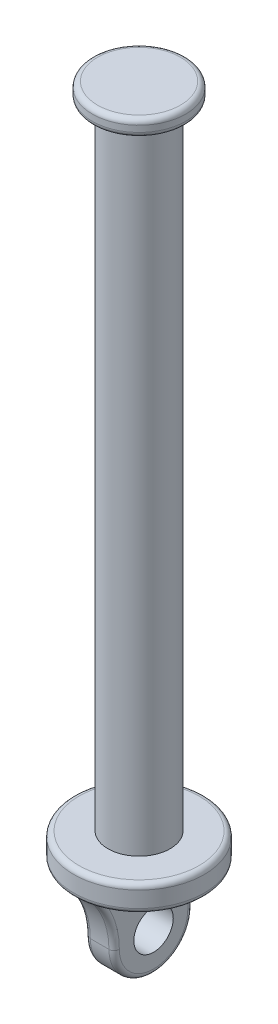
ISO-10303-21;
HEADER;
FILE_DESCRIPTION(('STEP AP214'),'2;1');
FILE_NAME('part.step','',(''),(''),'','','');
FILE_SCHEMA(('AUTOMOTIVE_DESIGN { 1 0 10303 214 1 1 1 1 }'));
ENDSEC;
DATA;
#1=APPLICATION_CONTEXT('core data for automotive mechanical design processes');
#2=APPLICATION_PROTOCOL_DEFINITION('international standard','automotive_design',2000,#1);
#3=PRODUCT_CONTEXT('',#1,'mechanical');
#4=PRODUCT('Part','Part','',(#3));
#5=PRODUCT_RELATED_PRODUCT_CATEGORY('part','',(#4));
#6=PRODUCT_DEFINITION_FORMATION('','',#4);
#7=PRODUCT_DEFINITION_CONTEXT('part definition',#1,'design');
#8=PRODUCT_DEFINITION('design','',#6,#7);
#9=PRODUCT_DEFINITION_SHAPE('','',#8);
#10=(LENGTH_UNIT() NAMED_UNIT(*) SI_UNIT(.MILLI.,.METRE.));
#11=(NAMED_UNIT(*) PLANE_ANGLE_UNIT() SI_UNIT($,.RADIAN.));
#12=(NAMED_UNIT(*) SI_UNIT($,.STERADIAN.) SOLID_ANGLE_UNIT());
#13=UNCERTAINTY_MEASURE_WITH_UNIT(LENGTH_MEASURE(1.E-05),#10,'distance_accuracy_value','');
#14=(GEOMETRIC_REPRESENTATION_CONTEXT(3) GLOBAL_UNCERTAINTY_ASSIGNED_CONTEXT((#13)) GLOBAL_UNIT_ASSIGNED_CONTEXT((#10,
#11,#12)) REPRESENTATION_CONTEXT('',''));
#15=CARTESIAN_POINT('',(0.,0.,0.));
#16=DIRECTION('',(0.,0.,1.));
#17=DIRECTION('',(1.,0.,0.));
#18=AXIS2_PLACEMENT_3D('',#15,#16,#17);
#19=CARTESIAN_POINT('',(0.,-12.7,0.));
#20=DIRECTION('',(0.,-1.,0.));
#21=DIRECTION('',(0.,0.,-1.));
#22=AXIS2_PLACEMENT_3D('',#19,#20,#21);
#23=PLANE('',#22);
#24=CARTESIAN_POINT('',(0.,-12.7,0.));
#25=DIRECTION('',(0.,-1.,0.));
#26=DIRECTION('',(0.,0.,-1.));
#27=AXIS2_PLACEMENT_3D('',#24,#25,#26);
#28=CIRCLE('',#27,29.);
#29=CARTESIAN_POINT('',(0.,-12.7,-29.));
#30=VERTEX_POINT('',#29);
#31=EDGE_CURVE('E11',#30,#30,#28,.T.);
#32=ORIENTED_EDGE('',*,*,#31,.T.);
#33=EDGE_LOOP('',(#32));
#34=FACE_BOUND('',#33,.T.);
#35=DIRECTION('',(0.,0.,1.));
#36=VECTOR('',#35,1.);
#37=CARTESIAN_POINT('',(7.,-12.7,28.5));
#38=LINE('',#37,#36);
#39=CARTESIAN_POINT('',(7.,-12.7,-25.2430946320034));
#40=VERTEX_POINT('',#39);
#41=CARTESIAN_POINT('',(7.,-12.7,25.2430946320035));
#42=VERTEX_POINT('',#41);
#43=EDGE_CURVE('E114',#40,#42,#38,.T.);
#44=ORIENTED_EDGE('',*,*,#43,.F.);
#45=CARTESIAN_POINT('',(7.,-12.7,-25.2430946320035));
#46=CARTESIAN_POINT('',(6.99999123906025,-12.7,-25.3486439759068));
#47=CARTESIAN_POINT('',(6.99588962701735,-12.7,-25.4541899029886));
#48=CARTESIAN_POINT('',(6.97953328991133,-12.7,-25.6646864109092));
#49=CARTESIAN_POINT('',(6.9672756133061,-12.7,-25.7696367623478));
#50=CARTESIAN_POINT('',(6.93454299293824,-12.7,-25.9788951030792));
#51=CARTESIAN_POINT('',(6.91401973456081,-12.7,-26.0831955885601));
#52=CARTESIAN_POINT('',(6.86474470719616,-12.7,-26.289796754506));
#53=CARTESIAN_POINT('',(6.83599427367258,-12.7,-26.3920977566572));
#54=CARTESIAN_POINT('',(6.74352718753706,-12.7,-26.6758347230998));
#55=CARTESIAN_POINT('',(6.67034368268867,-12.7,-26.8543053672607));
#56=CARTESIAN_POINT('',(6.49618556838796,-12.7,-27.1968497370266));
#57=CARTESIAN_POINT('',(6.39527518397814,-12.7,-27.3609555920294));
#58=CARTESIAN_POINT('',(6.19254343562665,-12.7,-27.6311139343284));
#59=CARTESIAN_POINT('',(6.09672249515228,-12.7,-27.7416595530389));
#60=CARTESIAN_POINT('',(5.88862722124047,-12.7,-27.9461180144706));
#61=CARTESIAN_POINT('',(5.77637058865681,-12.7,-28.0400485139364));
#62=CARTESIAN_POINT('',(5.5589103545626,-12.7,-28.1904807604052));
#63=CARTESIAN_POINT('',(5.45628319630114,-12.7,-28.2506949690182));
#64=CARTESIAN_POINT('',(5.24257096427967,-12.7,-28.353290750772));
#65=CARTESIAN_POINT('',(5.13150391937339,-12.7,-28.3957091402111));
#66=CARTESIAN_POINT('',(4.93357017321598,-12.7,-28.4514993764686));
#67=CARTESIAN_POINT('',(4.84802259957234,-12.7,-28.4695767060606));
#68=CARTESIAN_POINT('',(4.71834892063807,-12.7,-28.4877717632495));
#69=CARTESIAN_POINT('',(4.67481949174005,-12.7,-28.4923501131843));
#70=CARTESIAN_POINT('',(4.58753075502495,-12.7,-28.4984668140721));
#71=CARTESIAN_POINT('',(4.54377136398393,-12.7,-28.500003975746));
#72=CARTESIAN_POINT('',(4.5,-12.7,-28.5));
#73=B_SPLINE_CURVE_WITH_KNOTS('',3,(#45,#46,#47,#48,#49,#50,#51,#52,#53,#54,#55,#56,#57,#58,#59,
#60,#61,#62,#63,#64,#65,#66,#67,#68,#69,#70,#71,#72),.UNSPECIFIED.,.F.,.F.,(4,2,2,2,2,2,2,2,2,2,
2,2,2,4),(0.,0.316563018814054,0.633240658792551,0.95179687434557,1.27030141005097,
1.84659199003014,2.42155877433155,2.85889109396872,3.29575583509579,3.65130489404937,
4.00611471576225,4.2675948173172,4.39880751960702,4.53007152346516),.UNSPECIFIED.);
#74=CARTESIAN_POINT('',(4.5,-12.7,-28.5));
#75=VERTEX_POINT('',#74);
#76=EDGE_CURVE('E125',#40,#75,#73,.T.);
#77=ORIENTED_EDGE('',*,*,#76,.T.);
#78=DIRECTION('',(-1.,0.,0.));
#79=VECTOR('',#78,1.);
#80=CARTESIAN_POINT('',(7.,-12.7,-28.5));
#81=LINE('',#80,#79);
#82=CARTESIAN_POINT('',(-4.5,-12.7,-28.5));
#83=VERTEX_POINT('',#82);
#84=EDGE_CURVE('E247',#75,#83,#81,.T.);
#85=ORIENTED_EDGE('',*,*,#84,.T.);
#86=CARTESIAN_POINT('',(-4.5,-12.7,-28.5));
#87=CARTESIAN_POINT('',(-4.5582989225471,-12.7,-28.5000186197095));
#88=CARTESIAN_POINT('',(-4.61658787489257,-12.7,-28.4972815871199));
#89=CARTESIAN_POINT('',(-4.73262558582263,-12.7,-28.486439459007));
#90=CARTESIAN_POINT('',(-4.79037468671679,-12.7,-28.4783380375446));
#91=CARTESIAN_POINT('',(-4.90445838222015,-12.7,-28.4569914368231));
#92=CARTESIAN_POINT('',(-4.96080039127309,-12.7,-28.4437858159425));
#93=CARTESIAN_POINT('',(-5.07210028097705,-12.7,-28.4124904414024));
#94=CARTESIAN_POINT('',(-5.12705799015949,-12.7,-28.3944000859082));
#95=CARTESIAN_POINT('',(-5.28902696514693,-12.7,-28.3333491600073));
#96=CARTESIAN_POINT('',(-5.39352308640927,-12.7,-28.2835330256));
#97=CARTESIAN_POINT('',(-5.59369607351267,-12.7,-28.1684536520865));
#98=CARTESIAN_POINT('',(-5.68935448500511,-12.7,-28.1031590617142));
#99=CARTESIAN_POINT('',(-5.90341930900665,-12.7,-27.9342089137873));
#100=CARTESIAN_POINT('',(-6.01761433426957,-12.7,-27.8252062131662));
#101=CARTESIAN_POINT('',(-6.22682307442122,-12.7,-27.5901687896491));
#102=CARTESIAN_POINT('',(-6.32180425437553,-12.7,-27.4641057708021));
#103=CARTESIAN_POINT('',(-6.51710788208499,-12.7,-27.1620373856802));
#104=CARTESIAN_POINT('',(-6.61124274814623,-12.7,-26.9820356731435));
#105=CARTESIAN_POINT('',(-6.76903043270599,-12.7,-26.6091588928456));
#106=CARTESIAN_POINT('',(-6.83265022011471,-12.7,-26.4162701315383));
#107=CARTESIAN_POINT('',(-6.92090362295118,-12.7,-26.0597731048795));
#108=CARTESIAN_POINT('',(-6.95058905437294,-12.7,-25.8973956708807));
#109=CARTESIAN_POINT('',(-6.9802366226064,-12.7,-25.6524799218264));
#110=CARTESIAN_POINT('',(-6.98763900074072,-12.7,-25.5707872735162));
#111=CARTESIAN_POINT('',(-6.99751863217426,-12.7,-25.4071007818966));
#112=CARTESIAN_POINT('',(-6.99999564763601,-12.7,-25.3251069242339));
#113=CARTESIAN_POINT('',(-7.,-12.7,-25.2430946320035));
#114=B_SPLINE_CURVE_WITH_KNOTS('',3,(#86,#87,#88,#89,#90,#91,#92,#93,#94,#95,#96,#97,#98,#99,
#100,#101,#102,#103,#104,#105,#106,#107,#108,#109,#110,#111,#112,#113),.UNSPECIFIED.,.F.,.F.,(4,
2,2,2,2,2,2,2,2,2,2,2,2,4),(0.,0.17481626218431,0.349512916681652,0.522881946888718,
0.696272347169766,1.04187989552567,1.38819353725088,1.85920514400221,2.33100776205857,
2.93722574205025,3.54409845088531,4.03803822046266,4.28398970053323,4.52995305689819),.UNSPECIFIED.);
#115=CARTESIAN_POINT('',(-7.,-12.7,-25.2430946320034));
#116=VERTEX_POINT('',#115);
#117=EDGE_CURVE('E182',#83,#116,#114,.T.);
#118=ORIENTED_EDGE('',*,*,#117,.T.);
#119=DIRECTION('',(0.,0.,1.));
#120=VECTOR('',#119,1.);
#121=CARTESIAN_POINT('',(-7.,-12.7,28.5));
#122=LINE('',#121,#120);
#123=CARTESIAN_POINT('',(-7.,-12.7,25.2430946320035));
#124=VERTEX_POINT('',#123);
#125=EDGE_CURVE('E130',#116,#124,#122,.T.);
#126=ORIENTED_EDGE('',*,*,#125,.T.);
#127=CARTESIAN_POINT('',(-7.,-12.7,25.2430946320035));
#128=CARTESIAN_POINT('',(-6.99999123906025,-12.7,25.3486439759068));
#129=CARTESIAN_POINT('',(-6.99588962701735,-12.7,25.4541899029886));
#130=CARTESIAN_POINT('',(-6.97953328991133,-12.7,25.6646864109092));
#131=CARTESIAN_POINT('',(-6.9672756133061,-12.7,25.7696367623478));
#132=CARTESIAN_POINT('',(-6.93454299293823,-12.7,25.9788951030792));
#133=CARTESIAN_POINT('',(-6.91401973456081,-12.7,26.0831955885601));
#134=CARTESIAN_POINT('',(-6.86474470719616,-12.7,26.289796754506));
#135=CARTESIAN_POINT('',(-6.83599427367258,-12.7,26.3920977566572));
#136=CARTESIAN_POINT('',(-6.74352718753706,-12.7,26.6758347230998));
#137=CARTESIAN_POINT('',(-6.67034368268866,-12.7,26.8543053672607));
#138=CARTESIAN_POINT('',(-6.49618556838796,-12.7,27.1968497370266));
#139=CARTESIAN_POINT('',(-6.39527518397814,-12.7,27.3609555920294));
#140=CARTESIAN_POINT('',(-6.19254343562666,-12.7,27.6311139343284));
#141=CARTESIAN_POINT('',(-6.09672249515228,-12.7,27.7416595530389));
#142=CARTESIAN_POINT('',(-5.88862722124047,-12.7,27.9461180144706));
#143=CARTESIAN_POINT('',(-5.77637058865681,-12.7,28.0400485139364));
#144=CARTESIAN_POINT('',(-5.5589103545626,-12.7,28.1904807604052));
#145=CARTESIAN_POINT('',(-5.45628319630114,-12.7,28.2506949690182));
#146=CARTESIAN_POINT('',(-5.24257096427967,-12.7,28.353290750772));
#147=CARTESIAN_POINT('',(-5.13150391937339,-12.7,28.3957091402111));
#148=CARTESIAN_POINT('',(-4.93357017321598,-12.7,28.4514993764686));
#149=CARTESIAN_POINT('',(-4.84802259957234,-12.7,28.4695767060606));
#150=CARTESIAN_POINT('',(-4.71834892063807,-12.7,28.4877717632495));
#151=CARTESIAN_POINT('',(-4.67481949174005,-12.7,28.4923501131843));
#152=CARTESIAN_POINT('',(-4.58753075502495,-12.7,28.4984668140721));
#153=CARTESIAN_POINT('',(-4.54377136398393,-12.7,28.500003975746));
#154=CARTESIAN_POINT('',(-4.5,-12.7,28.5));
#155=B_SPLINE_CURVE_WITH_KNOTS('',3,(#127,#128,#129,#130,#131,#132,#133,#134,#135,#136,#137,
#138,#139,#140,#141,#142,#143,#144,#145,#146,#147,#148,#149,#150,#151,#152,#153,#154),
.UNSPECIFIED.,.F.,.F.,(4,2,2,2,2,2,2,2,2,2,2,2,2,4),(0.,0.31656301881405,0.633240658792551,
0.951796874345574,1.27030141005097,1.84659199003014,2.42155877433154,2.85889109396871,
3.29575583509578,3.65130489404936,4.00611471576224,4.26759481731719,4.39880751960702,
4.53007152346515),.UNSPECIFIED.);
#156=CARTESIAN_POINT('',(-4.5,-12.7,28.5));
#157=VERTEX_POINT('',#156);
#158=EDGE_CURVE('E175',#124,#157,#155,.T.);
#159=ORIENTED_EDGE('',*,*,#158,.T.);
#160=DIRECTION('',(-1.,0.,0.));
#161=VECTOR('',#160,1.);
#162=CARTESIAN_POINT('',(7.,-12.7,28.5));
#163=LINE('',#162,#161);
#164=CARTESIAN_POINT('',(4.5,-12.7,28.5));
#165=VERTEX_POINT('',#164);
#166=EDGE_CURVE('E129',#165,#157,#163,.T.);
#167=ORIENTED_EDGE('',*,*,#166,.F.);
#168=CARTESIAN_POINT('',(4.5,-12.7,28.5));
#169=CARTESIAN_POINT('',(4.5582989225471,-12.7,28.5000186197095));
#170=CARTESIAN_POINT('',(4.61658787489257,-12.7,28.4972815871199));
#171=CARTESIAN_POINT('',(4.73262558582263,-12.7,28.486439459007));
#172=CARTESIAN_POINT('',(4.79037468671679,-12.7,28.4783380375446));
#173=CARTESIAN_POINT('',(4.90445838222015,-12.7,28.4569914368231));
#174=CARTESIAN_POINT('',(4.96080039127309,-12.7,28.4437858159425));
#175=CARTESIAN_POINT('',(5.07210028097705,-12.7,28.4124904414024));
#176=CARTESIAN_POINT('',(5.1270579901595,-12.7,28.3944000859082));
#177=CARTESIAN_POINT('',(5.28902696514693,-12.7,28.3333491600073));
#178=CARTESIAN_POINT('',(5.39352308640927,-12.7,28.2835330256));
#179=CARTESIAN_POINT('',(5.59369607351267,-12.7,28.1684536520865));
#180=CARTESIAN_POINT('',(5.68935448500511,-12.7,28.1031590617142));
#181=CARTESIAN_POINT('',(5.90341930900665,-12.7,27.9342089137873));
#182=CARTESIAN_POINT('',(6.01761433426957,-12.7,27.8252062131662));
#183=CARTESIAN_POINT('',(6.22682307442122,-12.7,27.5901687896491));
#184=CARTESIAN_POINT('',(6.32180425437553,-12.7,27.4641057708021));
#185=CARTESIAN_POINT('',(6.51710788208499,-12.7,27.1620373856802));
#186=CARTESIAN_POINT('',(6.61124274814623,-12.7,26.9820356731435));
#187=CARTESIAN_POINT('',(6.76903043270599,-12.7,26.6091588928456));
#188=CARTESIAN_POINT('',(6.83265022011471,-12.7,26.4162701315383));
#189=CARTESIAN_POINT('',(6.92090362295118,-12.7,26.0597731048795));
#190=CARTESIAN_POINT('',(6.95058905437294,-12.7,25.8973956708807));
#191=CARTESIAN_POINT('',(6.9802366226064,-12.7,25.6524799218264));
#192=CARTESIAN_POINT('',(6.98763900074072,-12.7,25.5707872735162));
#193=CARTESIAN_POINT('',(6.99751863217426,-12.7,25.4071007818966));
#194=CARTESIAN_POINT('',(6.99999564763601,-12.7,25.3251069242339));
#195=CARTESIAN_POINT('',(7.,-12.7,25.2430946320035));
#196=B_SPLINE_CURVE_WITH_KNOTS('',3,(#168,#169,#170,#171,#172,#173,#174,#175,#176,#177,#178,
#179,#180,#181,#182,#183,#184,#185,#186,#187,#188,#189,#190,#191,#192,#193,#194,#195),
.UNSPECIFIED.,.F.,.F.,(4,2,2,2,2,2,2,2,2,2,2,2,2,4),(0.,0.17481626218431,0.349512916681652,
0.522881946888718,0.696272347169766,1.04187989552567,1.38819353725088,1.85920514400221,
2.33100776205857,2.93722574205025,3.54409845088531,4.03803822046266,4.28398970053323,
4.52995305689818),.UNSPECIFIED.);
#197=EDGE_CURVE('E128',#165,#42,#196,.T.);
#198=ORIENTED_EDGE('',*,*,#197,.T.);
#199=EDGE_LOOP('',(#44,#77,#85,#118,#126,#159,#167,#198));
#200=FACE_BOUND('',#199,.T.);
#201=ADVANCED_FACE('F41',(#34,#200),#23,.T.);
#202=CARTESIAN_POINT('',(0.,305.,0.));
#203=DIRECTION('',(0.,-1.,0.));
#204=DIRECTION('',(0.,0.,-1.));
#205=AXIS2_PLACEMENT_3D('',#202,#203,#204);
#206=CYLINDRICAL_SURFACE('',#205,15.);
#207=CARTESIAN_POINT('',(0.,305.,0.));
#208=DIRECTION('',(0.,1.,0.));
#209=DIRECTION('',(0.,0.,1.));
#210=AXIS2_PLACEMENT_3D('',#207,#208,#209);
#211=CIRCLE('',#210,15.);
#212=CARTESIAN_POINT('',(0.,305.,15.));
#213=VERTEX_POINT('',#212);
#214=EDGE_CURVE('E245',#213,#213,#211,.T.);
#215=ORIENTED_EDGE('',*,*,#214,.F.);
#216=EDGE_LOOP('',(#215));
#217=FACE_BOUND('',#216,.T.);
#218=CARTESIAN_POINT('',(0.,0.,0.));
#219=DIRECTION('',(0.,1.,0.));
#220=DIRECTION('',(0.,0.,1.));
#221=AXIS2_PLACEMENT_3D('',#218,#219,#220);
#222=CIRCLE('',#221,15.);
#223=CARTESIAN_POINT('',(0.,0.,15.));
#224=VERTEX_POINT('',#223);
#225=EDGE_CURVE('E241',#224,#224,#222,.T.);
#226=ORIENTED_EDGE('',*,*,#225,.T.);
#227=EDGE_LOOP('',(#226));
#228=FACE_BOUND('',#227,.T.);
#229=ADVANCED_FACE('F164',(#217,#228),#206,.T.);
#230=CARTESIAN_POINT('',(0.,313.,0.));
#231=DIRECTION('',(0.,-1.,0.));
#232=DIRECTION('',(0.,0.,-1.));
#233=AXIS2_PLACEMENT_3D('',#230,#231,#232);
#234=CYLINDRICAL_SURFACE('',#233,22.5);
#235=CARTESIAN_POINT('',(0.,307.5,0.));
#236=DIRECTION('',(0.,1.,0.));
#237=DIRECTION('',(0.,0.,1.));
#238=AXIS2_PLACEMENT_3D('',#235,#236,#237);
#239=CIRCLE('',#238,22.5);
#240=CARTESIAN_POINT('',(0.,307.5,22.5));
#241=VERTEX_POINT('',#240);
#242=EDGE_CURVE('E261',#241,#241,#239,.T.);
#243=ORIENTED_EDGE('',*,*,#242,.T.);
#244=EDGE_LOOP('',(#243));
#245=FACE_BOUND('',#244,.T.);
#246=CARTESIAN_POINT('',(0.,310.5,0.));
#247=DIRECTION('',(0.,1.,0.));
#248=DIRECTION('',(0.,0.,1.));
#249=AXIS2_PLACEMENT_3D('',#246,#247,#248);
#250=CIRCLE('',#249,22.5);
#251=CARTESIAN_POINT('',(0.,310.5,22.5));
#252=VERTEX_POINT('',#251);
#253=EDGE_CURVE('E258',#252,#252,#250,.F.);
#254=ORIENTED_EDGE('',*,*,#253,.T.);
#255=EDGE_LOOP('',(#254));
#256=FACE_BOUND('',#255,.T.);
#257=ADVANCED_FACE('F284',(#245,#256),#234,.T.);
#258=CARTESIAN_POINT('',(0.,313.,0.));
#259=DIRECTION('',(0.,1.,0.));
#260=DIRECTION('',(0.,0.,1.));
#261=AXIS2_PLACEMENT_3D('',#258,#259,#260);
#262=PLANE('',#261);
#263=CARTESIAN_POINT('',(0.,313.,0.));
#264=DIRECTION('',(0.,1.,0.));
#265=DIRECTION('',(0.,0.,1.));
#266=AXIS2_PLACEMENT_3D('',#263,#264,#265);
#267=CIRCLE('',#266,20.);
#268=CARTESIAN_POINT('',(0.,313.,20.));
#269=VERTEX_POINT('',#268);
#270=EDGE_CURVE('E267',#269,#269,#267,.T.);
#271=ORIENTED_EDGE('',*,*,#270,.T.);
#272=EDGE_LOOP('',(#271));
#273=FACE_BOUND('',#272,.T.);
#274=ADVANCED_FACE('F271',(#273),#262,.T.);
#275=CARTESIAN_POINT('',(0.,305.,0.));
#276=DIRECTION('',(0.,1.,0.));
#277=DIRECTION('',(0.,0.,1.));
#278=AXIS2_PLACEMENT_3D('',#275,#276,#277);
#279=PLANE('',#278);
#280=CARTESIAN_POINT('',(0.,305.,0.));
#281=DIRECTION('',(0.,1.,0.));
#282=DIRECTION('',(0.,0.,1.));
#283=AXIS2_PLACEMENT_3D('',#280,#281,#282);
#284=CIRCLE('',#283,20.);
#285=CARTESIAN_POINT('',(0.,305.,20.));
#286=VERTEX_POINT('',#285);
#287=EDGE_CURVE('E264',#286,#286,#284,.F.);
#288=ORIENTED_EDGE('',*,*,#287,.T.);
#289=EDGE_LOOP('',(#288));
#290=FACE_BOUND('',#289,.T.);
#291=ORIENTED_EDGE('',*,*,#214,.T.);
#292=EDGE_LOOP('',(#291));
#293=FACE_BOUND('',#292,.T.);
#294=ADVANCED_FACE('F292',(#290,#293),#279,.F.);
#295=CARTESIAN_POINT('',(0.,-12.7,0.));
#296=DIRECTION('',(0.,1.,0.));
#297=DIRECTION('',(0.,0.,1.));
#298=AXIS2_PLACEMENT_3D('',#295,#296,#297);
#299=CYLINDRICAL_SURFACE('',#298,31.5);
#300=CARTESIAN_POINT('',(0.,-2.5,0.));
#301=DIRECTION('',(0.,-1.,0.));
#302=DIRECTION('',(0.,0.,-1.));
#303=AXIS2_PLACEMENT_3D('',#300,#301,#302);
#304=CIRCLE('',#303,31.5);
#305=CARTESIAN_POINT('',(0.,-2.5,-31.5));
#306=VERTEX_POINT('',#305);
#307=EDGE_CURVE('E217',#306,#306,#304,.T.);
#308=ORIENTED_EDGE('',*,*,#307,.T.);
#309=EDGE_LOOP('',(#308));
#310=FACE_BOUND('',#309,.T.);
#311=CARTESIAN_POINT('',(0.,-10.2,0.));
#312=DIRECTION('',(0.,-1.,0.));
#313=DIRECTION('',(0.,0.,-1.));
#314=AXIS2_PLACEMENT_3D('',#311,#312,#313);
#315=CIRCLE('',#314,31.5);
#316=CARTESIAN_POINT('',(0.,-10.2,-31.5));
#317=VERTEX_POINT('',#316);
#318=EDGE_CURVE('E219',#317,#317,#315,.F.);
#319=ORIENTED_EDGE('',*,*,#318,.T.);
#320=EDGE_LOOP('',(#319));
#321=FACE_BOUND('',#320,.T.);
#322=ADVANCED_FACE('F343',(#310,#321),#299,.T.);
#323=CARTESIAN_POINT('',(0.,0.,0.));
#324=DIRECTION('',(0.,-1.,0.));
#325=DIRECTION('',(0.,0.,-1.));
#326=AXIS2_PLACEMENT_3D('',#323,#324,#325);
#327=PLANE('',#326);
#328=CARTESIAN_POINT('',(0.,0.,0.));
#329=DIRECTION('',(0.,-1.,0.));
#330=DIRECTION('',(0.,0.,-1.));
#331=AXIS2_PLACEMENT_3D('',#328,#329,#330);
#332=CIRCLE('',#331,29.);
#333=CARTESIAN_POINT('',(0.,0.,-29.));
#334=VERTEX_POINT('',#333);
#335=EDGE_CURVE('E49',#334,#334,#332,.F.);
#336=ORIENTED_EDGE('',*,*,#335,.T.);
#337=EDGE_LOOP('',(#336));
#338=FACE_BOUND('',#337,.T.);
#339=ORIENTED_EDGE('',*,*,#225,.F.);
#340=EDGE_LOOP('',(#339));
#341=FACE_BOUND('',#340,.T.);
#342=ADVANCED_FACE('F168',(#338,#341),#327,.F.);
#343=CARTESIAN_POINT('',(7.,-37.834818240167,56.99984056155));
#344=DIRECTION('',(-1.,0.,0.));
#345=DIRECTION('',(0.,0.,1.));
#346=AXIS2_PLACEMENT_3D('',#343,#344,#345);
#347=PLANE('',#346);
#348=ORIENTED_EDGE('',*,*,#43,.T.);
#349=CARTESIAN_POINT('',(7.,-37.834818240167,56.99984056155));
#350=DIRECTION('',(-1.,0.,0.));
#351=DIRECTION('',(0.,0.,1.));
#352=AXIS2_PLACEMENT_3D('',#349,#350,#351);
#353=CIRCLE('',#352,40.5);
#354=CARTESIAN_POINT('',(7.,-37.7390263326799,16.4999538467645));
#355=VERTEX_POINT('',#354);
#356=EDGE_CURVE('E122',#42,#355,#353,.T.);
#357=ORIENTED_EDGE('',*,*,#356,.T.);
#358=CARTESIAN_POINT('',(7.,-37.7,0.));
#359=DIRECTION('',(-1.,0.,0.));
#360=DIRECTION('',(0.,0.,1.));
#361=AXIS2_PLACEMENT_3D('',#358,#359,#360);
#362=CIRCLE('',#361,16.5);
#363=CARTESIAN_POINT('',(7.,-37.7390263326799,-16.4999538467645));
#364=VERTEX_POINT('',#363);
#365=EDGE_CURVE('E117',#355,#364,#362,.F.);
#366=ORIENTED_EDGE('',*,*,#365,.T.);
#367=CARTESIAN_POINT('',(7.,-37.834818240167,-56.99984056155));
#368=DIRECTION('',(-1.,0.,0.));
#369=DIRECTION('',(0.,0.,1.));
#370=AXIS2_PLACEMENT_3D('',#367,#368,#369);
#371=CIRCLE('',#370,40.5);
#372=EDGE_CURVE('E109',#364,#40,#371,.T.);
#373=ORIENTED_EDGE('',*,*,#372,.T.);
#374=EDGE_LOOP('',(#348,#357,#366,#373));
#375=FACE_BOUND('',#374,.T.);
#376=CARTESIAN_POINT('',(7.,-37.7,0.));
#377=DIRECTION('',(1.,0.,0.));
#378=DIRECTION('',(0.,0.,-1.));
#379=AXIS2_PLACEMENT_3D('',#376,#377,#378);
#380=CIRCLE('',#379,9.5);
#381=CARTESIAN_POINT('',(7.,-37.7,-9.50000000000001));
#382=VERTEX_POINT('',#381);
#383=EDGE_CURVE('E312',#382,#382,#380,.T.);
#384=ORIENTED_EDGE('',*,*,#383,.F.);
#385=EDGE_LOOP('',(#384));
#386=FACE_BOUND('',#385,.T.);
#387=ADVANCED_FACE('F111',(#375,#386),#347,.F.);
#388=CARTESIAN_POINT('',(-7.,-37.834818240167,56.99984056155));
#389=DIRECTION('',(-1.,0.,0.));
#390=DIRECTION('',(0.,0.,1.));
#391=AXIS2_PLACEMENT_3D('',#388,#389,#390);
#392=PLANE('',#391);
#393=CARTESIAN_POINT('',(-7.,-37.7,0.));
#394=DIRECTION('',(-1.,0.,0.));
#395=DIRECTION('',(0.,0.,1.));
#396=AXIS2_PLACEMENT_3D('',#393,#394,#395);
#397=CIRCLE('',#396,16.5);
#398=CARTESIAN_POINT('',(-7.,-37.7390263326799,-16.4999538467645));
#399=VERTEX_POINT('',#398);
#400=CARTESIAN_POINT('',(-7.,-37.7390263326799,16.4999538467645));
#401=VERTEX_POINT('',#400);
#402=EDGE_CURVE('E138',#399,#401,#397,.T.);
#403=ORIENTED_EDGE('',*,*,#402,.T.);
#404=CARTESIAN_POINT('',(-7.,-37.834818240167,56.99984056155));
#405=DIRECTION('',(-1.,0.,0.));
#406=DIRECTION('',(0.,0.,1.));
#407=AXIS2_PLACEMENT_3D('',#404,#405,#406);
#408=CIRCLE('',#407,40.5);
#409=EDGE_CURVE('E231',#401,#124,#408,.F.);
#410=ORIENTED_EDGE('',*,*,#409,.T.);
#411=ORIENTED_EDGE('',*,*,#125,.F.);
#412=CARTESIAN_POINT('',(-7.,-37.834818240167,-56.99984056155));
#413=DIRECTION('',(-1.,0.,0.));
#414=DIRECTION('',(0.,0.,1.));
#415=AXIS2_PLACEMENT_3D('',#412,#413,#414);
#416=CIRCLE('',#415,40.5);
#417=EDGE_CURVE('E316',#116,#399,#416,.F.);
#418=ORIENTED_EDGE('',*,*,#417,.T.);
#419=EDGE_LOOP('',(#403,#410,#411,#418));
#420=FACE_BOUND('',#419,.T.);
#421=CARTESIAN_POINT('',(-7.,-37.7,0.));
#422=DIRECTION('',(1.,0.,0.));
#423=DIRECTION('',(0.,0.,-1.));
#424=AXIS2_PLACEMENT_3D('',#421,#422,#423);
#425=CIRCLE('',#424,9.5);
#426=CARTESIAN_POINT('',(-7.,-37.7,-9.50000000000001));
#427=VERTEX_POINT('',#426);
#428=EDGE_CURVE('E310',#427,#427,#425,.T.);
#429=ORIENTED_EDGE('',*,*,#428,.T.);
#430=EDGE_LOOP('',(#429));
#431=FACE_BOUND('',#430,.T.);
#432=ADVANCED_FACE('F321',(#420,#431),#392,.T.);
#433=CARTESIAN_POINT('',(7.,-37.834818240167,56.99984056155));
#434=DIRECTION('',(-1.,0.,0.));
#435=DIRECTION('',(0.,0.,1.));
#436=AXIS2_PLACEMENT_3D('',#433,#434,#435);
#437=CYLINDRICAL_SURFACE('',#436,38.);
#438=ORIENTED_EDGE('',*,*,#166,.T.);
#439=CARTESIAN_POINT('',(-4.5,-37.834818240167,56.99984056155));
#440=DIRECTION('',(-1.,0.,0.));
#441=DIRECTION('',(0.,0.,1.));
#442=AXIS2_PLACEMENT_3D('',#439,#440,#441);
#443=CIRCLE('',#442,38.);
#444=CARTESIAN_POINT('',(-4.5,-37.744939413389,18.99994685385));
#445=VERTEX_POINT('',#444);
#446=EDGE_CURVE('E135',#157,#445,#443,.T.);
#447=ORIENTED_EDGE('',*,*,#446,.T.);
#448=DIRECTION('',(-1.,0.,0.));
#449=VECTOR('',#448,1.);
#450=CARTESIAN_POINT('',(7.,-37.744939413389,18.99994685385));
#451=LINE('',#450,#449);
#452=CARTESIAN_POINT('',(4.5,-37.744939413389,18.99994685385));
#453=VERTEX_POINT('',#452);
#454=EDGE_CURVE('E237',#453,#445,#451,.T.);
#455=ORIENTED_EDGE('',*,*,#454,.F.);
#456=CARTESIAN_POINT('',(4.5,-37.834818240167,56.99984056155));
#457=DIRECTION('',(-1.,0.,0.));
#458=DIRECTION('',(0.,0.,1.));
#459=AXIS2_PLACEMENT_3D('',#456,#457,#458);
#460=CIRCLE('',#459,38.);
#461=EDGE_CURVE('E255',#453,#165,#460,.F.);
#462=ORIENTED_EDGE('',*,*,#461,.T.);
#463=EDGE_LOOP('',(#438,#447,#455,#462));
#464=FACE_BOUND('',#463,.T.);
#465=ADVANCED_FACE('F166',(#464),#437,.F.);
#466=CARTESIAN_POINT('',(7.,-37.7,0.));
#467=DIRECTION('',(-1.,0.,0.));
#468=DIRECTION('',(0.,0.,1.));
#469=AXIS2_PLACEMENT_3D('',#466,#467,#468);
#470=CYLINDRICAL_SURFACE('',#469,19.);
#471=ORIENTED_EDGE('',*,*,#454,.T.);
#472=CARTESIAN_POINT('',(-4.5,-37.7,0.));
#473=DIRECTION('',(-1.,0.,0.));
#474=DIRECTION('',(0.,0.,1.));
#475=AXIS2_PLACEMENT_3D('',#472,#473,#474);
#476=CIRCLE('',#475,19.);
#477=CARTESIAN_POINT('',(-4.5,-37.744939413389,-18.99994685385));
#478=VERTEX_POINT('',#477);
#479=EDGE_CURVE('E56',#445,#478,#476,.F.);
#480=ORIENTED_EDGE('',*,*,#479,.T.);
#481=DIRECTION('',(-1.,0.,0.));
#482=VECTOR('',#481,1.);
#483=CARTESIAN_POINT('',(7.,-37.744939413389,-18.99994685385));
#484=LINE('',#483,#482);
#485=CARTESIAN_POINT('',(4.5,-37.744939413389,-18.99994685385));
#486=VERTEX_POINT('',#485);
#487=EDGE_CURVE('E242',#486,#478,#484,.T.);
#488=ORIENTED_EDGE('',*,*,#487,.F.);
#489=CARTESIAN_POINT('',(4.5,-37.7,0.));
#490=DIRECTION('',(-1.,0.,0.));
#491=DIRECTION('',(0.,0.,1.));
#492=AXIS2_PLACEMENT_3D('',#489,#490,#491);
#493=CIRCLE('',#492,19.);
#494=EDGE_CURVE('E140',#486,#453,#493,.T.);
#495=ORIENTED_EDGE('',*,*,#494,.T.);
#496=EDGE_LOOP('',(#471,#480,#488,#495));
#497=FACE_BOUND('',#496,.T.);
#498=ADVANCED_FACE('F239',(#497),#470,.T.);
#499=CARTESIAN_POINT('',(7.,-37.834818240167,-56.99984056155));
#500=DIRECTION('',(-1.,0.,0.));
#501=DIRECTION('',(0.,0.,1.));
#502=AXIS2_PLACEMENT_3D('',#499,#500,#501);
#503=CYLINDRICAL_SURFACE('',#502,38.);
#504=ORIENTED_EDGE('',*,*,#487,.T.);
#505=CARTESIAN_POINT('',(-4.5,-37.834818240167,-56.99984056155));
#506=DIRECTION('',(-1.,0.,0.));
#507=DIRECTION('',(0.,0.,1.));
#508=AXIS2_PLACEMENT_3D('',#505,#506,#507);
#509=CIRCLE('',#508,38.);
#510=EDGE_CURVE('E63',#478,#83,#509,.T.);
#511=ORIENTED_EDGE('',*,*,#510,.T.);
#512=ORIENTED_EDGE('',*,*,#84,.F.);
#513=CARTESIAN_POINT('',(4.5,-37.834818240167,-56.99984056155));
#514=DIRECTION('',(-1.,0.,0.));
#515=DIRECTION('',(0.,0.,1.));
#516=AXIS2_PLACEMENT_3D('',#513,#514,#515);
#517=CIRCLE('',#516,38.);
#518=EDGE_CURVE('E134',#75,#486,#517,.F.);
#519=ORIENTED_EDGE('',*,*,#518,.T.);
#520=EDGE_LOOP('',(#504,#511,#512,#519));
#521=FACE_BOUND('',#520,.T.);
#522=ADVANCED_FACE('F329',(#521),#503,.F.);
#523=CARTESIAN_POINT('',(7.,-37.7,0.));
#524=DIRECTION('',(-1.,0.,0.));
#525=DIRECTION('',(0.,0.,1.));
#526=AXIS2_PLACEMENT_3D('',#523,#524,#525);
#527=CYLINDRICAL_SURFACE('',#526,9.5);
#528=ORIENTED_EDGE('',*,*,#383,.T.);
#529=EDGE_LOOP('',(#528));
#530=FACE_BOUND('',#529,.T.);
#531=ORIENTED_EDGE('',*,*,#428,.F.);
#532=EDGE_LOOP('',(#531));
#533=FACE_BOUND('',#532,.T.);
#534=ADVANCED_FACE('F307',(#530,#533),#527,.F.);
#535=CARTESIAN_POINT('',(4.5,-37.834818240167,-56.99984056155));
#536=DIRECTION('',(-1.,0.,0.));
#537=DIRECTION('',(0.,0.,1.));
#538=AXIS2_PLACEMENT_3D('',#535,#536,#537);
#539=TOROIDAL_SURFACE('',#538,40.5,2.5);
#540=ORIENTED_EDGE('',*,*,#76,.F.);
#541=ORIENTED_EDGE('',*,*,#372,.F.);
#542=CARTESIAN_POINT('',(4.5,-37.7390263326799,-16.4999538467645));
#543=DIRECTION('',(0.,-0.99999720283421,0.00236523228363261));
#544=DIRECTION('',(0.,-0.00236523228363261,-0.99999720283421));
#545=AXIS2_PLACEMENT_3D('',#542,#543,#544);
#546=CIRCLE('',#545,2.5);
#547=EDGE_CURVE('E308',#486,#364,#546,.T.);
#548=ORIENTED_EDGE('',*,*,#547,.F.);
#549=ORIENTED_EDGE('',*,*,#518,.F.);
#550=EDGE_LOOP('',(#540,#541,#548,#549));
#551=FACE_BOUND('',#550,.T.);
#552=ADVANCED_FACE('F133',(#551),#539,.T.);
#553=CARTESIAN_POINT('',(4.5,-37.7,0.));
#554=DIRECTION('',(-1.,0.,0.));
#555=DIRECTION('',(0.,0.,1.));
#556=AXIS2_PLACEMENT_3D('',#553,#554,#555);
#557=TOROIDAL_SURFACE('',#556,16.5,2.5);
#558=ORIENTED_EDGE('',*,*,#547,.T.);
#559=ORIENTED_EDGE('',*,*,#365,.F.);
#560=CARTESIAN_POINT('',(4.5,-37.7390263326799,16.4999538467645));
#561=DIRECTION('',(0.,0.99999720283421,0.00236523228362984));
#562=DIRECTION('',(0.,-0.00236523228362984,0.99999720283421));
#563=AXIS2_PLACEMENT_3D('',#560,#561,#562);
#564=CIRCLE('',#563,2.5);
#565=EDGE_CURVE('E155',#453,#355,#564,.T.);
#566=ORIENTED_EDGE('',*,*,#565,.F.);
#567=ORIENTED_EDGE('',*,*,#494,.F.);
#568=EDGE_LOOP('',(#558,#559,#566,#567));
#569=FACE_BOUND('',#568,.T.);
#570=ADVANCED_FACE('F300',(#569),#557,.T.);
#571=CARTESIAN_POINT('',(4.5,-37.834818240167,56.99984056155));
#572=DIRECTION('',(-1.,0.,0.));
#573=DIRECTION('',(0.,0.,1.));
#574=AXIS2_PLACEMENT_3D('',#571,#572,#573);
#575=TOROIDAL_SURFACE('',#574,40.5,2.5);
#576=ORIENTED_EDGE('',*,*,#197,.F.);
#577=ORIENTED_EDGE('',*,*,#461,.F.);
#578=ORIENTED_EDGE('',*,*,#565,.T.);
#579=ORIENTED_EDGE('',*,*,#356,.F.);
#580=EDGE_LOOP('',(#576,#577,#578,#579));
#581=FACE_BOUND('',#580,.T.);
#582=ADVANCED_FACE('F280',(#581),#575,.T.);
#583=CARTESIAN_POINT('',(0.,307.5,0.));
#584=DIRECTION('',(0.,1.,0.));
#585=DIRECTION('',(0.,0.,1.));
#586=AXIS2_PLACEMENT_3D('',#583,#584,#585);
#587=TOROIDAL_SURFACE('',#586,20.,2.5);
#588=ORIENTED_EDGE('',*,*,#287,.F.);
#589=EDGE_LOOP('',(#588));
#590=FACE_BOUND('',#589,.T.);
#591=ORIENTED_EDGE('',*,*,#242,.F.);
#592=EDGE_LOOP('',(#591));
#593=FACE_BOUND('',#592,.T.);
#594=ADVANCED_FACE('F274',(#590,#593),#587,.T.);
#595=CARTESIAN_POINT('',(0.,310.5,0.));
#596=DIRECTION('',(0.,1.,0.));
#597=DIRECTION('',(0.,0.,1.));
#598=AXIS2_PLACEMENT_3D('',#595,#596,#597);
#599=TOROIDAL_SURFACE('',#598,20.,2.5);
#600=ORIENTED_EDGE('',*,*,#253,.F.);
#601=EDGE_LOOP('',(#600));
#602=FACE_BOUND('',#601,.T.);
#603=ORIENTED_EDGE('',*,*,#270,.F.);
#604=EDGE_LOOP('',(#603));
#605=FACE_BOUND('',#604,.T.);
#606=ADVANCED_FACE('F198',(#602,#605),#599,.T.);
#607=CARTESIAN_POINT('',(-4.5,-37.834818240167,-56.99984056155));
#608=DIRECTION('',(-1.,0.,0.));
#609=DIRECTION('',(0.,0.,1.));
#610=AXIS2_PLACEMENT_3D('',#607,#608,#609);
#611=TOROIDAL_SURFACE('',#610,40.5,2.5);
#612=ORIENTED_EDGE('',*,*,#117,.F.);
#613=ORIENTED_EDGE('',*,*,#510,.F.);
#614=CARTESIAN_POINT('',(-4.5,-37.7390263326799,-16.4999538467645));
#615=DIRECTION('',(0.,-0.99999720283421,0.00236523228363261));
#616=DIRECTION('',(0.,-0.00236523228363261,-0.99999720283421));
#617=AXIS2_PLACEMENT_3D('',#614,#615,#616);
#618=CIRCLE('',#617,2.5);
#619=EDGE_CURVE('E224',#399,#478,#618,.T.);
#620=ORIENTED_EDGE('',*,*,#619,.F.);
#621=ORIENTED_EDGE('',*,*,#417,.F.);
#622=EDGE_LOOP('',(#612,#613,#620,#621));
#623=FACE_BOUND('',#622,.T.);
#624=ADVANCED_FACE('F200',(#623),#611,.T.);
#625=CARTESIAN_POINT('',(-4.5,-37.7,0.));
#626=DIRECTION('',(-1.,0.,0.));
#627=DIRECTION('',(0.,0.,1.));
#628=AXIS2_PLACEMENT_3D('',#625,#626,#627);
#629=TOROIDAL_SURFACE('',#628,16.5,2.5);
#630=ORIENTED_EDGE('',*,*,#619,.T.);
#631=ORIENTED_EDGE('',*,*,#479,.F.);
#632=CARTESIAN_POINT('',(-4.5,-37.7390263326799,16.4999538467645));
#633=DIRECTION('',(0.,0.99999720283421,0.00236523228363262));
#634=DIRECTION('',(0.,-0.00236523228363262,0.99999720283421));
#635=AXIS2_PLACEMENT_3D('',#632,#633,#634);
#636=CIRCLE('',#635,2.5);
#637=EDGE_CURVE('E226',#401,#445,#636,.T.);
#638=ORIENTED_EDGE('',*,*,#637,.F.);
#639=ORIENTED_EDGE('',*,*,#402,.F.);
#640=EDGE_LOOP('',(#630,#631,#638,#639));
#641=FACE_BOUND('',#640,.T.);
#642=ADVANCED_FACE('F196',(#641),#629,.T.);
#643=CARTESIAN_POINT('',(-4.5,-37.834818240167,56.99984056155));
#644=DIRECTION('',(-1.,0.,0.));
#645=DIRECTION('',(0.,0.,1.));
#646=AXIS2_PLACEMENT_3D('',#643,#644,#645);
#647=TOROIDAL_SURFACE('',#646,40.5,2.5);
#648=ORIENTED_EDGE('',*,*,#158,.F.);
#649=ORIENTED_EDGE('',*,*,#409,.F.);
#650=ORIENTED_EDGE('',*,*,#637,.T.);
#651=ORIENTED_EDGE('',*,*,#446,.F.);
#652=EDGE_LOOP('',(#648,#649,#650,#651));
#653=FACE_BOUND('',#652,.T.);
#654=ADVANCED_FACE('F190',(#653),#647,.T.);
#655=CARTESIAN_POINT('',(0.,-2.5,0.));
#656=DIRECTION('',(0.,-1.,0.));
#657=DIRECTION('',(0.,0.,-1.));
#658=AXIS2_PLACEMENT_3D('',#655,#656,#657);
#659=TOROIDAL_SURFACE('',#658,29.,2.5);
#660=ORIENTED_EDGE('',*,*,#335,.F.);
#661=EDGE_LOOP('',(#660));
#662=FACE_BOUND('',#661,.T.);
#663=ORIENTED_EDGE('',*,*,#307,.F.);
#664=EDGE_LOOP('',(#663));
#665=FACE_BOUND('',#664,.T.);
#666=ADVANCED_FACE('F195',(#662,#665),#659,.T.);
#667=CARTESIAN_POINT('',(0.,-10.2,0.));
#668=DIRECTION('',(0.,-1.,0.));
#669=DIRECTION('',(0.,0.,-1.));
#670=AXIS2_PLACEMENT_3D('',#667,#668,#669);
#671=TOROIDAL_SURFACE('',#670,29.,2.5);
#672=ORIENTED_EDGE('',*,*,#318,.F.);
#673=EDGE_LOOP('',(#672));
#674=FACE_BOUND('',#673,.T.);
#675=ORIENTED_EDGE('',*,*,#31,.F.);
#676=EDGE_LOOP('',(#675));
#677=FACE_BOUND('',#676,.T.);
#678=ADVANCED_FACE('F43',(#674,#677),#671,.T.);
#679=CLOSED_SHELL('',(#201,#229,#257,#274,#294,#322,#342,#387,#432,#465,#498,#522,#534,#552,
#570,#582,#594,#606,#624,#642,#654,#666,#678));
#680=MANIFOLD_SOLID_BREP('B2',#679);
#681=ADVANCED_BREP_SHAPE_REPRESENTATION('',(#18,#680),#14);
#682=SHAPE_DEFINITION_REPRESENTATION(#9,#681);
ENDSEC;
END-ISO-10303-21;
